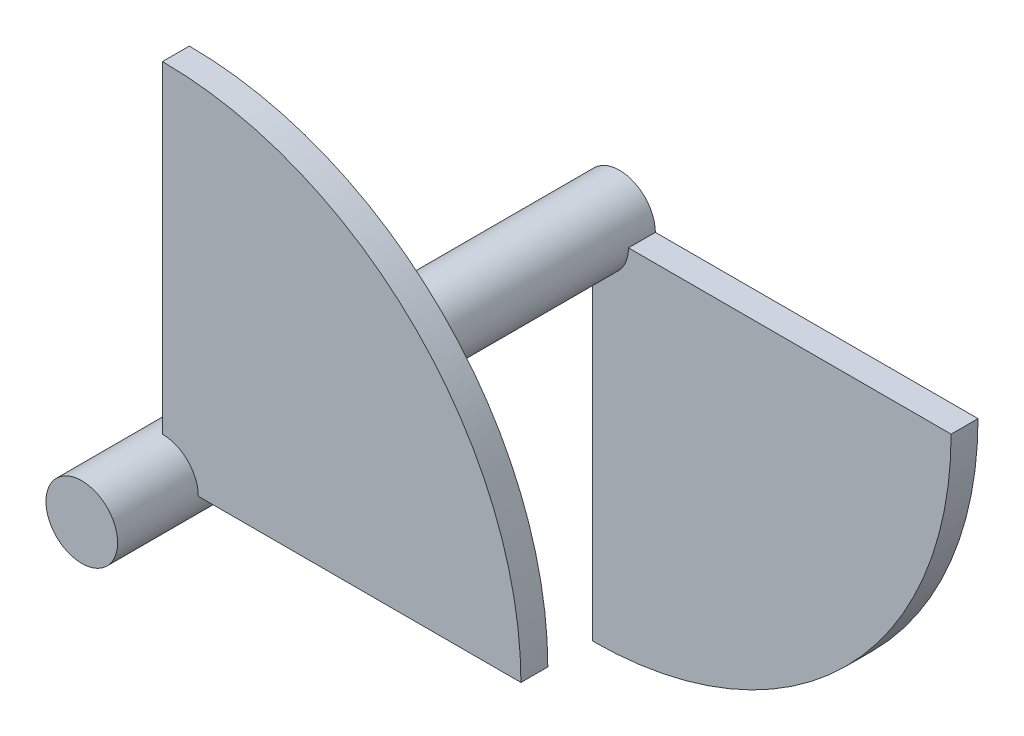
ISO-10303-21;
HEADER;
FILE_DESCRIPTION(('STEP AP214'),'2;1');
FILE_NAME('part.step','',(''),(''),'','','');
FILE_SCHEMA(('AUTOMOTIVE_DESIGN { 1 0 10303 214 1 1 1 1 }'));
ENDSEC;
DATA;
#1=APPLICATION_CONTEXT('core data for automotive mechanical design processes');
#2=APPLICATION_PROTOCOL_DEFINITION('international standard','automotive_design',2000,#1);
#3=PRODUCT_CONTEXT('',#1,'mechanical');
#4=PRODUCT('Part','Part','',(#3));
#5=PRODUCT_RELATED_PRODUCT_CATEGORY('part','',(#4));
#6=PRODUCT_DEFINITION_FORMATION('','',#4);
#7=PRODUCT_DEFINITION_CONTEXT('part definition',#1,'design');
#8=PRODUCT_DEFINITION('design','',#6,#7);
#9=PRODUCT_DEFINITION_SHAPE('','',#8);
#10=(LENGTH_UNIT() NAMED_UNIT(*) SI_UNIT(.MILLI.,.METRE.));
#11=(NAMED_UNIT(*) PLANE_ANGLE_UNIT() SI_UNIT($,.RADIAN.));
#12=(NAMED_UNIT(*) SI_UNIT($,.STERADIAN.) SOLID_ANGLE_UNIT());
#13=UNCERTAINTY_MEASURE_WITH_UNIT(LENGTH_MEASURE(1.E-05),#10,'distance_accuracy_value','');
#14=(GEOMETRIC_REPRESENTATION_CONTEXT(3) GLOBAL_UNCERTAINTY_ASSIGNED_CONTEXT((#13)) GLOBAL_UNIT_ASSIGNED_CONTEXT((#10,
#11,#12)) REPRESENTATION_CONTEXT('',''));
#15=CARTESIAN_POINT('',(0.,0.,0.));
#16=DIRECTION('',(0.,0.,1.));
#17=DIRECTION('',(1.,0.,0.));
#18=AXIS2_PLACEMENT_3D('',#15,#16,#17);
#19=CARTESIAN_POINT('',(0.,0.,60.));
#20=DIRECTION('',(0.,0.,-1.));
#21=DIRECTION('',(-1.,0.,0.));
#22=AXIS2_PLACEMENT_3D('',#19,#20,#21);
#23=CYLINDRICAL_SURFACE('',#22,4.);
#24=CARTESIAN_POINT('',(0.,0.,60.));
#25=DIRECTION('',(0.,0.,1.));
#26=DIRECTION('',(1.,0.,0.));
#27=AXIS2_PLACEMENT_3D('',#24,#25,#26);
#28=CIRCLE('',#27,4.);
#29=CARTESIAN_POINT('',(4.,0.,60.));
#30=VERTEX_POINT('',#29);
#31=EDGE_CURVE('E152',#30,#30,#28,.T.);
#32=ORIENTED_EDGE('',*,*,#31,.F.);
#33=EDGE_LOOP('',(#32));
#34=FACE_BOUND('',#33,.T.);
#35=CARTESIAN_POINT('',(0.,0.,51.));
#36=DIRECTION('',(0.,0.,-1.));
#37=DIRECTION('',(-1.,0.,0.));
#38=AXIS2_PLACEMENT_3D('',#35,#36,#37);
#39=CIRCLE('',#38,4.);
#40=CARTESIAN_POINT('',(0.,4.,51.));
#41=VERTEX_POINT('',#40);
#42=CARTESIAN_POINT('',(4.,0.,51.));
#43=VERTEX_POINT('',#42);
#44=EDGE_CURVE('E57',#41,#43,#39,.T.);
#45=ORIENTED_EDGE('',*,*,#44,.F.);
#46=DIRECTION('',(0.,0.,-1.));
#47=VECTOR('',#46,1.);
#48=CARTESIAN_POINT('',(0.,4.,60.));
#49=LINE('',#48,#47);
#50=CARTESIAN_POINT('',(0.,4.,48.));
#51=VERTEX_POINT('',#50);
#52=EDGE_CURVE('E42',#41,#51,#49,.T.);
#53=ORIENTED_EDGE('',*,*,#52,.T.);
#54=CARTESIAN_POINT('',(0.,0.,48.));
#55=DIRECTION('',(0.,0.,1.));
#56=DIRECTION('',(1.,0.,0.));
#57=AXIS2_PLACEMENT_3D('',#54,#55,#56);
#58=CIRCLE('',#57,4.);
#59=CARTESIAN_POINT('',(4.,0.,48.));
#60=VERTEX_POINT('',#59);
#61=EDGE_CURVE('E160',#60,#51,#58,.T.);
#62=ORIENTED_EDGE('',*,*,#61,.F.);
#63=DIRECTION('',(0.,0.,-1.));
#64=VECTOR('',#63,1.);
#65=CARTESIAN_POINT('',(4.,0.,60.));
#66=LINE('',#65,#64);
#67=EDGE_CURVE('E155',#43,#60,#66,.T.);
#68=ORIENTED_EDGE('',*,*,#67,.F.);
#69=EDGE_LOOP('',(#45,#53,#62,#68));
#70=FACE_BOUND('',#69,.T.);
#71=DIRECTION('',(0.,0.,-1.));
#72=VECTOR('',#71,1.);
#73=CARTESIAN_POINT('',(0.,-4.,60.));
#74=LINE('',#73,#72);
#75=CARTESIAN_POINT('',(0.,-4.,3.));
#76=VERTEX_POINT('',#75);
#77=CARTESIAN_POINT('',(0.,-4.,0.));
#78=VERTEX_POINT('',#77);
#79=EDGE_CURVE('E128',#76,#78,#74,.T.);
#80=ORIENTED_EDGE('',*,*,#79,.F.);
#81=CARTESIAN_POINT('',(0.,0.,3.));
#82=DIRECTION('',(0.,0.,1.));
#83=DIRECTION('',(1.,0.,0.));
#84=AXIS2_PLACEMENT_3D('',#81,#82,#83);
#85=CIRCLE('',#84,4.);
#86=CARTESIAN_POINT('',(4.,0.,3.));
#87=VERTEX_POINT('',#86);
#88=EDGE_CURVE('E11',#76,#87,#85,.T.);
#89=ORIENTED_EDGE('',*,*,#88,.T.);
#90=DIRECTION('',(0.,0.,-1.));
#91=VECTOR('',#90,1.);
#92=CARTESIAN_POINT('',(4.,0.,60.));
#93=LINE('',#92,#91);
#94=CARTESIAN_POINT('',(4.,0.,0.));
#95=VERTEX_POINT('',#94);
#96=EDGE_CURVE('E103',#87,#95,#93,.T.);
#97=ORIENTED_EDGE('',*,*,#96,.T.);
#98=CARTESIAN_POINT('',(0.,0.,0.));
#99=DIRECTION('',(0.,0.,1.));
#100=DIRECTION('',(1.,0.,0.));
#101=AXIS2_PLACEMENT_3D('',#98,#99,#100);
#102=CIRCLE('',#101,4.);
#103=EDGE_CURVE('E151',#95,#78,#102,.T.);
#104=ORIENTED_EDGE('',*,*,#103,.T.);
#105=EDGE_LOOP('',(#80,#89,#97,#104));
#106=FACE_BOUND('',#105,.T.);
#107=ADVANCED_FACE('F35',(#34,#70,#106),#23,.T.);
#108=CARTESIAN_POINT('',(0.,0.,60.));
#109=DIRECTION('',(0.,0.,1.));
#110=DIRECTION('',(1.,0.,0.));
#111=AXIS2_PLACEMENT_3D('',#108,#109,#110);
#112=PLANE('',#111);
#113=ORIENTED_EDGE('',*,*,#31,.T.);
#114=EDGE_LOOP('',(#113));
#115=FACE_BOUND('',#114,.T.);
#116=ADVANCED_FACE('F191',(#115),#112,.T.);
#117=CARTESIAN_POINT('',(0.,0.,0.));
#118=DIRECTION('',(0.,0.,1.));
#119=DIRECTION('',(1.,0.,0.));
#120=AXIS2_PLACEMENT_3D('',#117,#118,#119);
#121=PLANE('',#120);
#122=ORIENTED_EDGE('',*,*,#103,.F.);
#123=DIRECTION('',(-1.,0.,0.));
#124=VECTOR('',#123,1.);
#125=CARTESIAN_POINT('',(0.,0.,0.));
#126=LINE('',#125,#124);
#127=CARTESIAN_POINT('',(40.0000000000001,0.,0.));
#128=VERTEX_POINT('',#127);
#129=EDGE_CURVE('E49',#128,#95,#126,.T.);
#130=ORIENTED_EDGE('',*,*,#129,.F.);
#131=CARTESIAN_POINT('',(0.,0.,0.));
#132=DIRECTION('',(0.,0.,1.));
#133=DIRECTION('',(1.,0.,0.));
#134=AXIS2_PLACEMENT_3D('',#131,#132,#133);
#135=CIRCLE('',#134,40.0000000000001);
#136=CARTESIAN_POINT('',(-1.39659253553726E-13,-40.0000000000001,0.));
#137=VERTEX_POINT('',#136);
#138=EDGE_CURVE('E114',#137,#128,#135,.T.);
#139=ORIENTED_EDGE('',*,*,#138,.F.);
#140=DIRECTION('',(0.,1.,0.));
#141=VECTOR('',#140,1.);
#142=CARTESIAN_POINT('',(0.,0.,0.));
#143=LINE('',#142,#141);
#144=EDGE_CURVE('E123',#137,#78,#143,.T.);
#145=ORIENTED_EDGE('',*,*,#144,.T.);
#146=EDGE_LOOP('',(#122,#130,#139,#145));
#147=FACE_BOUND('',#146,.T.);
#148=ADVANCED_FACE('F196',(#147),#121,.F.);
#149=CARTESIAN_POINT('',(0.,0.,0.));
#150=DIRECTION('',(-1.,0.,0.));
#151=DIRECTION('',(0.,0.,1.));
#152=AXIS2_PLACEMENT_3D('',#149,#150,#151);
#153=PLANE('',#152);
#154=ORIENTED_EDGE('',*,*,#52,.F.);
#155=DIRECTION('',(0.,1.,0.));
#156=VECTOR('',#155,1.);
#157=CARTESIAN_POINT('',(0.,0.,51.));
#158=LINE('',#157,#156);
#159=CARTESIAN_POINT('',(-1.39659253553725E-13,40.,51.));
#160=VERTEX_POINT('',#159);
#161=EDGE_CURVE('E138',#41,#160,#158,.T.);
#162=ORIENTED_EDGE('',*,*,#161,.T.);
#163=DIRECTION('',(0.,0.,-1.));
#164=VECTOR('',#163,1.);
#165=CARTESIAN_POINT('',(-1.39659253553725E-13,40.,48.));
#166=LINE('',#165,#164);
#167=CARTESIAN_POINT('',(-1.39659253553725E-13,40.,48.));
#168=VERTEX_POINT('',#167);
#169=EDGE_CURVE('E140',#160,#168,#166,.T.);
#170=ORIENTED_EDGE('',*,*,#169,.T.);
#171=DIRECTION('',(0.,-1.,0.));
#172=VECTOR('',#171,1.);
#173=CARTESIAN_POINT('',(0.,0.,48.));
#174=LINE('',#173,#172);
#175=EDGE_CURVE('E143',#168,#51,#174,.T.);
#176=ORIENTED_EDGE('',*,*,#175,.T.);
#177=EDGE_LOOP('',(#154,#162,#170,#176));
#178=FACE_BOUND('',#177,.T.);
#179=ADVANCED_FACE('F170',(#178),#153,.T.);
#180=CARTESIAN_POINT('',(0.,0.,0.));
#181=DIRECTION('',(0.,1.,0.));
#182=DIRECTION('',(0.,0.,1.));
#183=AXIS2_PLACEMENT_3D('',#180,#181,#182);
#184=PLANE('',#183);
#185=DIRECTION('',(1.,0.,0.));
#186=VECTOR('',#185,1.);
#187=CARTESIAN_POINT('',(0.,0.,51.));
#188=LINE('',#187,#186);
#189=CARTESIAN_POINT('',(40.,0.,51.));
#190=VERTEX_POINT('',#189);
#191=EDGE_CURVE('E130',#43,#190,#188,.T.);
#192=ORIENTED_EDGE('',*,*,#191,.F.);
#193=ORIENTED_EDGE('',*,*,#67,.T.);
#194=DIRECTION('',(-1.,0.,0.));
#195=VECTOR('',#194,1.);
#196=CARTESIAN_POINT('',(0.,0.,48.));
#197=LINE('',#196,#195);
#198=CARTESIAN_POINT('',(40.,0.,48.));
#199=VERTEX_POINT('',#198);
#200=EDGE_CURVE('E135',#199,#60,#197,.T.);
#201=ORIENTED_EDGE('',*,*,#200,.F.);
#202=DIRECTION('',(0.,0.,-1.));
#203=VECTOR('',#202,1.);
#204=CARTESIAN_POINT('',(40.,0.,48.));
#205=LINE('',#204,#203);
#206=EDGE_CURVE('E132',#190,#199,#205,.T.);
#207=ORIENTED_EDGE('',*,*,#206,.F.);
#208=EDGE_LOOP('',(#192,#193,#201,#207));
#209=FACE_BOUND('',#208,.T.);
#210=ADVANCED_FACE('F178',(#209),#184,.F.);
#211=CARTESIAN_POINT('',(0.,0.,51.));
#212=DIRECTION('',(0.,0.,-1.));
#213=DIRECTION('',(-1.,0.,0.));
#214=AXIS2_PLACEMENT_3D('',#211,#212,#213);
#215=PLANE('',#214);
#216=ORIENTED_EDGE('',*,*,#161,.F.);
#217=ORIENTED_EDGE('',*,*,#44,.T.);
#218=ORIENTED_EDGE('',*,*,#191,.T.);
#219=CARTESIAN_POINT('',(0.,0.,51.));
#220=DIRECTION('',(0.,0.,-1.));
#221=DIRECTION('',(-1.,0.,0.));
#222=AXIS2_PLACEMENT_3D('',#219,#220,#221);
#223=CIRCLE('',#222,40.);
#224=EDGE_CURVE('E148',#160,#190,#223,.T.);
#225=ORIENTED_EDGE('',*,*,#224,.F.);
#226=EDGE_LOOP('',(#216,#217,#218,#225));
#227=FACE_BOUND('',#226,.T.);
#228=ADVANCED_FACE('F180',(#227),#215,.F.);
#229=CARTESIAN_POINT('',(0.,0.,-2.76133837621769));
#230=DIRECTION('',(0.,0.,-1.));
#231=DIRECTION('',(-1.,0.,0.));
#232=AXIS2_PLACEMENT_3D('',#229,#230,#231);
#233=CYLINDRICAL_SURFACE('',#232,40.);
#234=CARTESIAN_POINT('',(0.,0.,48.));
#235=DIRECTION('',(0.,0.,-1.));
#236=DIRECTION('',(-1.,0.,0.));
#237=AXIS2_PLACEMENT_3D('',#234,#235,#236);
#238=CIRCLE('',#237,40.);
#239=EDGE_CURVE('E146',#168,#199,#238,.T.);
#240=ORIENTED_EDGE('',*,*,#239,.F.);
#241=ORIENTED_EDGE('',*,*,#169,.F.);
#242=ORIENTED_EDGE('',*,*,#224,.T.);
#243=ORIENTED_EDGE('',*,*,#206,.T.);
#244=EDGE_LOOP('',(#240,#241,#242,#243));
#245=FACE_BOUND('',#244,.T.);
#246=ADVANCED_FACE('F174',(#245),#233,.T.);
#247=CARTESIAN_POINT('',(0.,0.,48.));
#248=DIRECTION('',(0.,0.,1.));
#249=DIRECTION('',(1.,0.,0.));
#250=AXIS2_PLACEMENT_3D('',#247,#248,#249);
#251=PLANE('',#250);
#252=ORIENTED_EDGE('',*,*,#200,.T.);
#253=ORIENTED_EDGE('',*,*,#61,.T.);
#254=ORIENTED_EDGE('',*,*,#175,.F.);
#255=ORIENTED_EDGE('',*,*,#239,.T.);
#256=EDGE_LOOP('',(#252,#253,#254,#255));
#257=FACE_BOUND('',#256,.T.);
#258=ADVANCED_FACE('F168',(#257),#251,.F.);
#259=CARTESIAN_POINT('',(0.,0.,0.));
#260=DIRECTION('',(1.,0.,0.));
#261=DIRECTION('',(0.,0.,1.));
#262=AXIS2_PLACEMENT_3D('',#259,#260,#261);
#263=PLANE('',#262);
#264=DIRECTION('',(0.,-1.,0.));
#265=VECTOR('',#264,1.);
#266=CARTESIAN_POINT('',(0.,0.,3.));
#267=LINE('',#266,#265);
#268=CARTESIAN_POINT('',(-1.39659253553725E-13,-40.,3.));
#269=VERTEX_POINT('',#268);
#270=EDGE_CURVE('E110',#76,#269,#267,.T.);
#271=ORIENTED_EDGE('',*,*,#270,.F.);
#272=ORIENTED_EDGE('',*,*,#79,.T.);
#273=ORIENTED_EDGE('',*,*,#144,.F.);
#274=DIRECTION('',(0.,0.,-1.));
#275=VECTOR('',#274,1.);
#276=CARTESIAN_POINT('',(-1.39659253553726E-13,-40.0000000000001,0.));
#277=LINE('',#276,#275);
#278=EDGE_CURVE('E121',#269,#137,#277,.T.);
#279=ORIENTED_EDGE('',*,*,#278,.F.);
#280=EDGE_LOOP('',(#271,#272,#273,#279));
#281=FACE_BOUND('',#280,.T.);
#282=ADVANCED_FACE('F211',(#281),#263,.F.);
#283=CARTESIAN_POINT('',(0.,0.,0.));
#284=DIRECTION('',(0.,1.,0.));
#285=DIRECTION('',(0.,0.,1.));
#286=AXIS2_PLACEMENT_3D('',#283,#284,#285);
#287=PLANE('',#286);
#288=ORIENTED_EDGE('',*,*,#96,.F.);
#289=DIRECTION('',(1.,0.,0.));
#290=VECTOR('',#289,1.);
#291=CARTESIAN_POINT('',(0.,0.,3.));
#292=LINE('',#291,#290);
#293=CARTESIAN_POINT('',(40.,0.,3.));
#294=VERTEX_POINT('',#293);
#295=EDGE_CURVE('E98',#87,#294,#292,.T.);
#296=ORIENTED_EDGE('',*,*,#295,.T.);
#297=DIRECTION('',(0.,0.,-1.));
#298=VECTOR('',#297,1.);
#299=CARTESIAN_POINT('',(40.0000000000001,0.,0.));
#300=LINE('',#299,#298);
#301=EDGE_CURVE('E102',#294,#128,#300,.T.);
#302=ORIENTED_EDGE('',*,*,#301,.T.);
#303=ORIENTED_EDGE('',*,*,#129,.T.);
#304=EDGE_LOOP('',(#288,#296,#302,#303));
#305=FACE_BOUND('',#304,.T.);
#306=ADVANCED_FACE('F100',(#305),#287,.T.);
#307=CARTESIAN_POINT('',(0.,0.,3.));
#308=DIRECTION('',(0.,0.,1.));
#309=DIRECTION('',(1.,0.,0.));
#310=AXIS2_PLACEMENT_3D('',#307,#308,#309);
#311=PLANE('',#310);
#312=ORIENTED_EDGE('',*,*,#88,.F.);
#313=ORIENTED_EDGE('',*,*,#270,.T.);
#314=CARTESIAN_POINT('',(0.,0.,3.));
#315=DIRECTION('',(0.,0.,1.));
#316=DIRECTION('',(1.,0.,0.));
#317=AXIS2_PLACEMENT_3D('',#314,#315,#316);
#318=CIRCLE('',#317,40.);
#319=EDGE_CURVE('E107',#269,#294,#318,.T.);
#320=ORIENTED_EDGE('',*,*,#319,.T.);
#321=ORIENTED_EDGE('',*,*,#295,.F.);
#322=EDGE_LOOP('',(#312,#313,#320,#321));
#323=FACE_BOUND('',#322,.T.);
#324=ADVANCED_FACE('F108',(#323),#311,.T.);
#325=CARTESIAN_POINT('',(0.,0.,-6.37026563166685));
#326=DIRECTION('',(0.,0.,1.));
#327=DIRECTION('',(1.,0.,0.));
#328=AXIS2_PLACEMENT_3D('',#325,#326,#327);
#329=CYLINDRICAL_SURFACE('',#328,40.0000000000001);
#330=ORIENTED_EDGE('',*,*,#138,.T.);
#331=ORIENTED_EDGE('',*,*,#301,.F.);
#332=ORIENTED_EDGE('',*,*,#319,.F.);
#333=ORIENTED_EDGE('',*,*,#278,.T.);
#334=EDGE_LOOP('',(#330,#331,#332,#333));
#335=FACE_BOUND('',#334,.T.);
#336=ADVANCED_FACE('F116',(#335),#329,.T.);
#337=CLOSED_SHELL('',(#107,#116,#148,#179,#210,#228,#246,#258,#282,#306,#324,#336));
#338=MANIFOLD_SOLID_BREP('B2',#337);
#339=ADVANCED_BREP_SHAPE_REPRESENTATION('',(#18,#338),#14);
#340=SHAPE_DEFINITION_REPRESENTATION(#9,#339);
ENDSEC;
END-ISO-10303-21;
